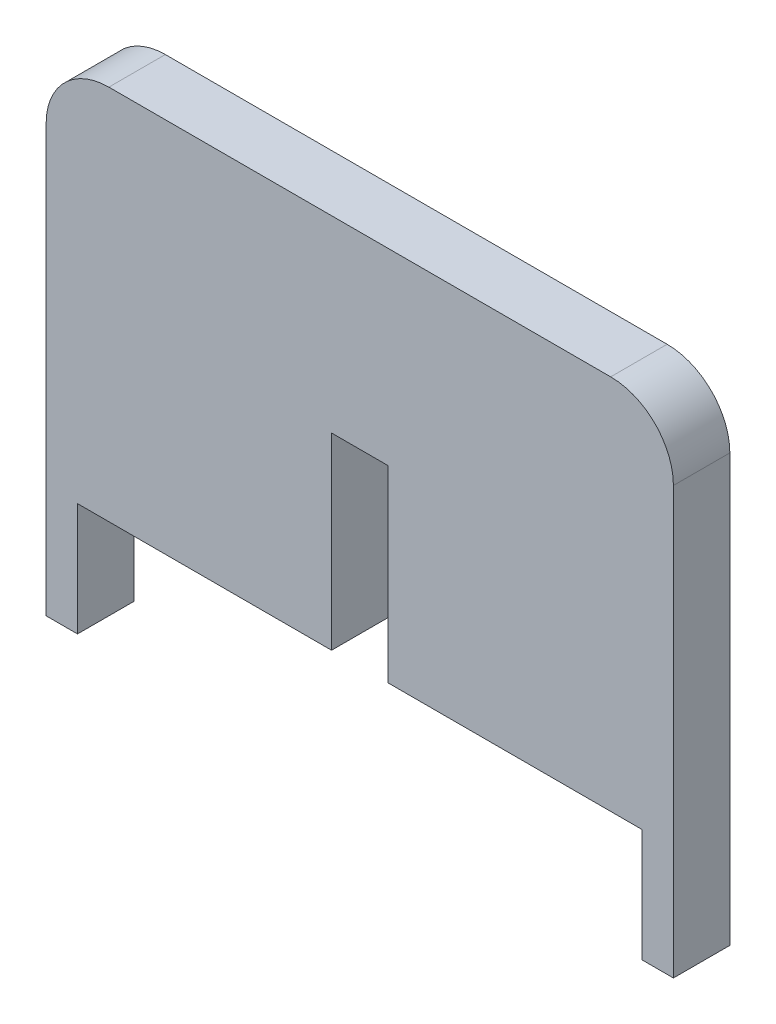
ISO-10303-21;
HEADER;
FILE_DESCRIPTION(('STEP AP214'),'2;1');
FILE_NAME('part.step','',(''),(''),'','','');
FILE_SCHEMA(('AUTOMOTIVE_DESIGN { 1 0 10303 214 1 1 1 1 }'));
ENDSEC;
DATA;
#1=APPLICATION_CONTEXT('core data for automotive mechanical design processes');
#2=APPLICATION_PROTOCOL_DEFINITION('international standard','automotive_design',2000,#1);
#3=PRODUCT_CONTEXT('',#1,'mechanical');
#4=PRODUCT('Part','Part','',(#3));
#5=PRODUCT_RELATED_PRODUCT_CATEGORY('part','',(#4));
#6=PRODUCT_DEFINITION_FORMATION('','',#4);
#7=PRODUCT_DEFINITION_CONTEXT('part definition',#1,'design');
#8=PRODUCT_DEFINITION('design','',#6,#7);
#9=PRODUCT_DEFINITION_SHAPE('','',#8);
#10=(LENGTH_UNIT() NAMED_UNIT(*) SI_UNIT(.MILLI.,.METRE.));
#11=(NAMED_UNIT(*) PLANE_ANGLE_UNIT() SI_UNIT($,.RADIAN.));
#12=(NAMED_UNIT(*) SI_UNIT($,.STERADIAN.) SOLID_ANGLE_UNIT());
#13=UNCERTAINTY_MEASURE_WITH_UNIT(LENGTH_MEASURE(1.E-05),#10,'distance_accuracy_value','');
#14=(GEOMETRIC_REPRESENTATION_CONTEXT(3) GLOBAL_UNCERTAINTY_ASSIGNED_CONTEXT((#13)) GLOBAL_UNIT_ASSIGNED_CONTEXT((#10,
#11,#12)) REPRESENTATION_CONTEXT('',''));
#15=CARTESIAN_POINT('',(0.,0.,0.));
#16=DIRECTION('',(0.,0.,1.));
#17=DIRECTION('',(1.,0.,0.));
#18=AXIS2_PLACEMENT_3D('',#15,#16,#17);
#19=CARTESIAN_POINT('',(-2.25000000000001,0.,4.5));
#20=DIRECTION('',(1.,0.,0.));
#21=DIRECTION('',(0.,0.,-1.));
#22=AXIS2_PLACEMENT_3D('',#19,#20,#21);
#23=PLANE('',#22);
#24=DIRECTION('',(0.,-1.,0.));
#25=VECTOR('',#24,1.);
#26=CARTESIAN_POINT('',(-2.25000000000001,0.,0.));
#27=LINE('',#26,#25);
#28=CARTESIAN_POINT('',(-2.25000000000001,0.,0.));
#29=VERTEX_POINT('',#28);
#30=CARTESIAN_POINT('',(-2.25000000000001,-15.,0.));
#31=VERTEX_POINT('',#30);
#32=EDGE_CURVE('E146',#29,#31,#27,.T.);
#33=ORIENTED_EDGE('',*,*,#32,.F.);
#34=DIRECTION('',(0.,0.,-1.));
#35=VECTOR('',#34,1.);
#36=CARTESIAN_POINT('',(-2.25000000000001,0.,4.5));
#37=LINE('',#36,#35);
#38=CARTESIAN_POINT('',(-2.25000000000001,0.,4.5));
#39=VERTEX_POINT('',#38);
#40=EDGE_CURVE('E140',#39,#29,#37,.T.);
#41=ORIENTED_EDGE('',*,*,#40,.F.);
#42=DIRECTION('',(0.,-1.,0.));
#43=VECTOR('',#42,1.);
#44=CARTESIAN_POINT('',(-2.25000000000001,0.,4.5));
#45=LINE('',#44,#43);
#46=CARTESIAN_POINT('',(-2.25000000000001,-15.,4.5));
#47=VERTEX_POINT('',#46);
#48=EDGE_CURVE('E143',#39,#47,#45,.T.);
#49=ORIENTED_EDGE('',*,*,#48,.T.);
#50=DIRECTION('',(0.,0.,-1.));
#51=VECTOR('',#50,1.);
#52=CARTESIAN_POINT('',(-2.25000000000001,-15.,4.5));
#53=LINE('',#52,#51);
#54=EDGE_CURVE('E190',#47,#31,#53,.T.);
#55=ORIENTED_EDGE('',*,*,#54,.T.);
#56=EDGE_LOOP('',(#33,#41,#49,#55));
#57=FACE_BOUND('',#56,.T.);
#58=ADVANCED_FACE('F35',(#57),#23,.T.);
#59=CARTESIAN_POINT('',(0.,0.,4.5));
#60=DIRECTION('',(0.,1.,0.));
#61=DIRECTION('',(0.,0.,1.));
#62=AXIS2_PLACEMENT_3D('',#59,#60,#61);
#63=PLANE('',#62);
#64=DIRECTION('',(1.,0.,0.));
#65=VECTOR('',#64,1.);
#66=CARTESIAN_POINT('',(0.,0.,0.));
#67=LINE('',#66,#65);
#68=CARTESIAN_POINT('',(2.24999999999999,0.,0.));
#69=VERTEX_POINT('',#68);
#70=EDGE_CURVE('E192',#29,#69,#67,.T.);
#71=ORIENTED_EDGE('',*,*,#70,.T.);
#72=DIRECTION('',(0.,0.,-1.));
#73=VECTOR('',#72,1.);
#74=CARTESIAN_POINT('',(2.24999999999999,0.,4.5));
#75=LINE('',#74,#73);
#76=CARTESIAN_POINT('',(2.24999999999999,0.,4.5));
#77=VERTEX_POINT('',#76);
#78=EDGE_CURVE('E150',#77,#69,#75,.T.);
#79=ORIENTED_EDGE('',*,*,#78,.F.);
#80=DIRECTION('',(1.,0.,0.));
#81=VECTOR('',#80,1.);
#82=CARTESIAN_POINT('',(0.,0.,4.5));
#83=LINE('',#82,#81);
#84=EDGE_CURVE('E153',#39,#77,#83,.T.);
#85=ORIENTED_EDGE('',*,*,#84,.F.);
#86=ORIENTED_EDGE('',*,*,#40,.T.);
#87=EDGE_LOOP('',(#71,#79,#85,#86));
#88=FACE_BOUND('',#87,.T.);
#89=ADVANCED_FACE('F154',(#88),#63,.F.);
#90=CARTESIAN_POINT('',(2.24999999999999,0.,4.5));
#91=DIRECTION('',(1.,0.,0.));
#92=DIRECTION('',(0.,0.,-1.));
#93=AXIS2_PLACEMENT_3D('',#90,#91,#92);
#94=PLANE('',#93);
#95=DIRECTION('',(0.,-1.,0.));
#96=VECTOR('',#95,1.);
#97=CARTESIAN_POINT('',(2.24999999999999,0.,0.));
#98=LINE('',#97,#96);
#99=CARTESIAN_POINT('',(2.24999999999999,-15.,0.));
#100=VERTEX_POINT('',#99);
#101=EDGE_CURVE('E194',#69,#100,#98,.T.);
#102=ORIENTED_EDGE('',*,*,#101,.T.);
#103=DIRECTION('',(0.,0.,-1.));
#104=VECTOR('',#103,1.);
#105=CARTESIAN_POINT('',(2.24999999999999,-15.,4.5));
#106=LINE('',#105,#104);
#107=CARTESIAN_POINT('',(2.24999999999999,-15.,4.5));
#108=VERTEX_POINT('',#107);
#109=EDGE_CURVE('E232',#108,#100,#106,.T.);
#110=ORIENTED_EDGE('',*,*,#109,.F.);
#111=DIRECTION('',(0.,-1.,0.));
#112=VECTOR('',#111,1.);
#113=CARTESIAN_POINT('',(2.24999999999999,0.,4.5));
#114=LINE('',#113,#112);
#115=EDGE_CURVE('E157',#77,#108,#114,.T.);
#116=ORIENTED_EDGE('',*,*,#115,.F.);
#117=ORIENTED_EDGE('',*,*,#78,.T.);
#118=EDGE_LOOP('',(#102,#110,#116,#117));
#119=FACE_BOUND('',#118,.T.);
#120=ADVANCED_FACE('F272',(#119),#94,.F.);
#121=CARTESIAN_POINT('',(0.,-15.,4.5));
#122=DIRECTION('',(0.,-1.,0.));
#123=DIRECTION('',(0.,0.,-1.));
#124=AXIS2_PLACEMENT_3D('',#121,#122,#123);
#125=PLANE('',#124);
#126=DIRECTION('',(-1.,0.,0.));
#127=VECTOR('',#126,1.);
#128=CARTESIAN_POINT('',(0.,-15.,0.));
#129=LINE('',#128,#127);
#130=CARTESIAN_POINT('',(22.5,-15.,0.));
#131=VERTEX_POINT('',#130);
#132=EDGE_CURVE('E197',#131,#100,#129,.T.);
#133=ORIENTED_EDGE('',*,*,#132,.F.);
#134=DIRECTION('',(0.,0.,-1.));
#135=VECTOR('',#134,1.);
#136=CARTESIAN_POINT('',(22.5,-15.,4.5));
#137=LINE('',#136,#135);
#138=CARTESIAN_POINT('',(22.5,-15.,4.5));
#139=VERTEX_POINT('',#138);
#140=EDGE_CURVE('E230',#139,#131,#137,.T.);
#141=ORIENTED_EDGE('',*,*,#140,.F.);
#142=DIRECTION('',(-1.,0.,0.));
#143=VECTOR('',#142,1.);
#144=CARTESIAN_POINT('',(0.,-15.,4.5));
#145=LINE('',#144,#143);
#146=EDGE_CURVE('E170',#139,#108,#145,.T.);
#147=ORIENTED_EDGE('',*,*,#146,.T.);
#148=ORIENTED_EDGE('',*,*,#109,.T.);
#149=EDGE_LOOP('',(#133,#141,#147,#148));
#150=FACE_BOUND('',#149,.T.);
#151=ADVANCED_FACE('F267',(#150),#125,.T.);
#152=CARTESIAN_POINT('',(22.5,0.,4.5));
#153=DIRECTION('',(1.,0.,0.));
#154=DIRECTION('',(0.,1.,0.));
#155=AXIS2_PLACEMENT_3D('',#152,#153,#154);
#156=PLANE('',#155);
#157=DIRECTION('',(0.,-1.,0.));
#158=VECTOR('',#157,1.);
#159=CARTESIAN_POINT('',(22.5,0.,0.));
#160=LINE('',#159,#158);
#161=CARTESIAN_POINT('',(22.5,-24.,0.));
#162=VERTEX_POINT('',#161);
#163=EDGE_CURVE('E200',#131,#162,#160,.T.);
#164=ORIENTED_EDGE('',*,*,#163,.T.);
#165=DIRECTION('',(0.,0.,-1.));
#166=VECTOR('',#165,1.);
#167=CARTESIAN_POINT('',(22.5,-24.,4.5));
#168=LINE('',#167,#166);
#169=CARTESIAN_POINT('',(22.5,-24.,4.5));
#170=VERTEX_POINT('',#169);
#171=EDGE_CURVE('E228',#170,#162,#168,.T.);
#172=ORIENTED_EDGE('',*,*,#171,.F.);
#173=DIRECTION('',(0.,-1.,0.));
#174=VECTOR('',#173,1.);
#175=CARTESIAN_POINT('',(22.5,0.,4.5));
#176=LINE('',#175,#174);
#177=EDGE_CURVE('E173',#139,#170,#176,.T.);
#178=ORIENTED_EDGE('',*,*,#177,.F.);
#179=ORIENTED_EDGE('',*,*,#140,.T.);
#180=EDGE_LOOP('',(#164,#172,#178,#179));
#181=FACE_BOUND('',#180,.T.);
#182=ADVANCED_FACE('F303',(#181),#156,.F.);
#183=CARTESIAN_POINT('',(0.,-24.,4.5));
#184=DIRECTION('',(0.,-1.,0.));
#185=DIRECTION('',(0.,0.,-1.));
#186=AXIS2_PLACEMENT_3D('',#183,#184,#185);
#187=PLANE('',#186);
#188=DIRECTION('',(-1.,0.,0.));
#189=VECTOR('',#188,1.);
#190=CARTESIAN_POINT('',(0.,-24.,0.));
#191=LINE('',#190,#189);
#192=CARTESIAN_POINT('',(25.,-24.,0.));
#193=VERTEX_POINT('',#192);
#194=EDGE_CURVE('E203',#193,#162,#191,.T.);
#195=ORIENTED_EDGE('',*,*,#194,.F.);
#196=DIRECTION('',(0.,0.,-1.));
#197=VECTOR('',#196,1.);
#198=CARTESIAN_POINT('',(25.,-24.,4.5));
#199=LINE('',#198,#197);
#200=CARTESIAN_POINT('',(25.,-24.,4.5));
#201=VERTEX_POINT('',#200);
#202=EDGE_CURVE('E226',#201,#193,#199,.T.);
#203=ORIENTED_EDGE('',*,*,#202,.F.);
#204=DIRECTION('',(-1.,0.,0.));
#205=VECTOR('',#204,1.);
#206=CARTESIAN_POINT('',(0.,-24.,4.5));
#207=LINE('',#206,#205);
#208=EDGE_CURVE('E175',#201,#170,#207,.T.);
#209=ORIENTED_EDGE('',*,*,#208,.T.);
#210=ORIENTED_EDGE('',*,*,#171,.T.);
#211=EDGE_LOOP('',(#195,#203,#209,#210));
#212=FACE_BOUND('',#211,.T.);
#213=ADVANCED_FACE('F260',(#212),#187,.T.);
#214=CARTESIAN_POINT('',(25.,0.,4.5));
#215=DIRECTION('',(-1.,0.,0.));
#216=DIRECTION('',(0.,0.,1.));
#217=AXIS2_PLACEMENT_3D('',#214,#215,#216);
#218=PLANE('',#217);
#219=DIRECTION('',(0.,1.,0.));
#220=VECTOR('',#219,1.);
#221=CARTESIAN_POINT('',(25.,0.,0.));
#222=LINE('',#221,#220);
#223=CARTESIAN_POINT('',(25.,10.,0.));
#224=VERTEX_POINT('',#223);
#225=EDGE_CURVE('E206',#193,#224,#222,.T.);
#226=ORIENTED_EDGE('',*,*,#225,.T.);
#227=DIRECTION('',(0.,0.,-1.));
#228=VECTOR('',#227,1.);
#229=CARTESIAN_POINT('',(25.,10.,4.5));
#230=LINE('',#229,#228);
#231=CARTESIAN_POINT('',(25.,10.,4.5));
#232=VERTEX_POINT('',#231);
#233=EDGE_CURVE('E58',#224,#232,#230,.F.);
#234=ORIENTED_EDGE('',*,*,#233,.T.);
#235=DIRECTION('',(0.,1.,0.));
#236=VECTOR('',#235,1.);
#237=CARTESIAN_POINT('',(25.,0.,4.5));
#238=LINE('',#237,#236);
#239=EDGE_CURVE('E178',#201,#232,#238,.T.);
#240=ORIENTED_EDGE('',*,*,#239,.F.);
#241=ORIENTED_EDGE('',*,*,#202,.T.);
#242=EDGE_LOOP('',(#226,#234,#240,#241));
#243=FACE_BOUND('',#242,.T.);
#244=ADVANCED_FACE('F258',(#243),#218,.F.);
#245=CARTESIAN_POINT('',(0.,15.,4.5));
#246=DIRECTION('',(0.,-1.,0.));
#247=DIRECTION('',(0.,0.,-1.));
#248=AXIS2_PLACEMENT_3D('',#245,#246,#247);
#249=PLANE('',#248);
#250=DIRECTION('',(-1.,0.,0.));
#251=VECTOR('',#250,1.);
#252=CARTESIAN_POINT('',(0.,15.,4.5));
#253=LINE('',#252,#251);
#254=CARTESIAN_POINT('',(20.,15.,4.5));
#255=VERTEX_POINT('',#254);
#256=CARTESIAN_POINT('',(-20.,15.,4.5));
#257=VERTEX_POINT('',#256);
#258=EDGE_CURVE('E180',#255,#257,#253,.T.);
#259=ORIENTED_EDGE('',*,*,#258,.F.);
#260=DIRECTION('',(0.,0.,-1.));
#261=VECTOR('',#260,1.);
#262=CARTESIAN_POINT('',(20.,15.,4.5));
#263=LINE('',#262,#261);
#264=CARTESIAN_POINT('',(20.,15.,0.));
#265=VERTEX_POINT('',#264);
#266=EDGE_CURVE('E236',#255,#265,#263,.T.);
#267=ORIENTED_EDGE('',*,*,#266,.T.);
#268=DIRECTION('',(-1.,0.,0.));
#269=VECTOR('',#268,1.);
#270=CARTESIAN_POINT('',(0.,15.,0.));
#271=LINE('',#270,#269);
#272=CARTESIAN_POINT('',(-20.,15.,0.));
#273=VERTEX_POINT('',#272);
#274=EDGE_CURVE('E208',#265,#273,#271,.T.);
#275=ORIENTED_EDGE('',*,*,#274,.T.);
#276=DIRECTION('',(0.,0.,-1.));
#277=VECTOR('',#276,1.);
#278=CARTESIAN_POINT('',(-20.,15.,4.5));
#279=LINE('',#278,#277);
#280=EDGE_CURVE('E149',#273,#257,#279,.F.);
#281=ORIENTED_EDGE('',*,*,#280,.T.);
#282=EDGE_LOOP('',(#259,#267,#275,#281));
#283=FACE_BOUND('',#282,.T.);
#284=ADVANCED_FACE('F250',(#283),#249,.F.);
#285=CARTESIAN_POINT('',(-25.,0.,4.5));
#286=DIRECTION('',(-1.,0.,0.));
#287=DIRECTION('',(0.,0.,1.));
#288=AXIS2_PLACEMENT_3D('',#285,#286,#287);
#289=PLANE('',#288);
#290=DIRECTION('',(0.,1.,0.));
#291=VECTOR('',#290,1.);
#292=CARTESIAN_POINT('',(-25.,0.,4.5));
#293=LINE('',#292,#291);
#294=CARTESIAN_POINT('',(-25.,-24.,4.5));
#295=VERTEX_POINT('',#294);
#296=CARTESIAN_POINT('',(-25.,10.,4.5));
#297=VERTEX_POINT('',#296);
#298=EDGE_CURVE('E182',#295,#297,#293,.T.);
#299=ORIENTED_EDGE('',*,*,#298,.T.);
#300=DIRECTION('',(0.,0.,-1.));
#301=VECTOR('',#300,1.);
#302=CARTESIAN_POINT('',(-25.,10.,0.));
#303=LINE('',#302,#301);
#304=CARTESIAN_POINT('',(-25.,10.,0.));
#305=VERTEX_POINT('',#304);
#306=EDGE_CURVE('E11',#297,#305,#303,.T.);
#307=ORIENTED_EDGE('',*,*,#306,.T.);
#308=DIRECTION('',(0.,1.,0.));
#309=VECTOR('',#308,1.);
#310=CARTESIAN_POINT('',(-25.,0.,0.));
#311=LINE('',#310,#309);
#312=CARTESIAN_POINT('',(-25.,-24.,0.));
#313=VERTEX_POINT('',#312);
#314=EDGE_CURVE('E211',#313,#305,#311,.T.);
#315=ORIENTED_EDGE('',*,*,#314,.F.);
#316=DIRECTION('',(0.,0.,-1.));
#317=VECTOR('',#316,1.);
#318=CARTESIAN_POINT('',(-25.,-24.,4.5));
#319=LINE('',#318,#317);
#320=EDGE_CURVE('E224',#295,#313,#319,.T.);
#321=ORIENTED_EDGE('',*,*,#320,.F.);
#322=EDGE_LOOP('',(#299,#307,#315,#321));
#323=FACE_BOUND('',#322,.T.);
#324=ADVANCED_FACE('F284',(#323),#289,.T.);
#325=CARTESIAN_POINT('',(0.,-24.,4.5));
#326=DIRECTION('',(0.,1.,0.));
#327=DIRECTION('',(0.,0.,1.));
#328=AXIS2_PLACEMENT_3D('',#325,#326,#327);
#329=PLANE('',#328);
#330=DIRECTION('',(1.,0.,0.));
#331=VECTOR('',#330,1.);
#332=CARTESIAN_POINT('',(0.,-24.,0.));
#333=LINE('',#332,#331);
#334=CARTESIAN_POINT('',(-22.5,-24.,0.));
#335=VERTEX_POINT('',#334);
#336=EDGE_CURVE('E214',#313,#335,#333,.T.);
#337=ORIENTED_EDGE('',*,*,#336,.T.);
#338=DIRECTION('',(0.,0.,-1.));
#339=VECTOR('',#338,1.);
#340=CARTESIAN_POINT('',(-22.5,-24.,4.5));
#341=LINE('',#340,#339);
#342=CARTESIAN_POINT('',(-22.5,-24.,4.5));
#343=VERTEX_POINT('',#342);
#344=EDGE_CURVE('E222',#343,#335,#341,.T.);
#345=ORIENTED_EDGE('',*,*,#344,.F.);
#346=DIRECTION('',(1.,0.,0.));
#347=VECTOR('',#346,1.);
#348=CARTESIAN_POINT('',(0.,-24.,4.5));
#349=LINE('',#348,#347);
#350=EDGE_CURVE('E184',#295,#343,#349,.T.);
#351=ORIENTED_EDGE('',*,*,#350,.F.);
#352=ORIENTED_EDGE('',*,*,#320,.T.);
#353=EDGE_LOOP('',(#337,#345,#351,#352));
#354=FACE_BOUND('',#353,.T.);
#355=ADVANCED_FACE('F314',(#354),#329,.F.);
#356=CARTESIAN_POINT('',(-22.5,0.,4.5));
#357=DIRECTION('',(1.,0.,0.));
#358=DIRECTION('',(0.,1.,0.));
#359=AXIS2_PLACEMENT_3D('',#356,#357,#358);
#360=PLANE('',#359);
#361=DIRECTION('',(0.,-1.,0.));
#362=VECTOR('',#361,1.);
#363=CARTESIAN_POINT('',(-22.5,0.,0.));
#364=LINE('',#363,#362);
#365=CARTESIAN_POINT('',(-22.5,-15.,0.));
#366=VERTEX_POINT('',#365);
#367=EDGE_CURVE('E166',#366,#335,#364,.T.);
#368=ORIENTED_EDGE('',*,*,#367,.F.);
#369=DIRECTION('',(0.,0.,-1.));
#370=VECTOR('',#369,1.);
#371=CARTESIAN_POINT('',(-22.5,-15.,4.5));
#372=LINE('',#371,#370);
#373=CARTESIAN_POINT('',(-22.5,-15.,4.5));
#374=VERTEX_POINT('',#373);
#375=EDGE_CURVE('E220',#374,#366,#372,.T.);
#376=ORIENTED_EDGE('',*,*,#375,.F.);
#377=DIRECTION('',(0.,-1.,0.));
#378=VECTOR('',#377,1.);
#379=CARTESIAN_POINT('',(-22.5,0.,4.5));
#380=LINE('',#379,#378);
#381=EDGE_CURVE('E186',#374,#343,#380,.T.);
#382=ORIENTED_EDGE('',*,*,#381,.T.);
#383=ORIENTED_EDGE('',*,*,#344,.T.);
#384=EDGE_LOOP('',(#368,#376,#382,#383));
#385=FACE_BOUND('',#384,.T.);
#386=ADVANCED_FACE('F278',(#385),#360,.T.);
#387=CARTESIAN_POINT('',(0.,-15.,4.5));
#388=DIRECTION('',(0.,-1.,0.));
#389=DIRECTION('',(0.,0.,-1.));
#390=AXIS2_PLACEMENT_3D('',#387,#388,#389);
#391=PLANE('',#390);
#392=DIRECTION('',(-1.,0.,0.));
#393=VECTOR('',#392,1.);
#394=CARTESIAN_POINT('',(0.,-15.,0.));
#395=LINE('',#394,#393);
#396=EDGE_CURVE('E163',#31,#366,#395,.T.);
#397=ORIENTED_EDGE('',*,*,#396,.F.);
#398=ORIENTED_EDGE('',*,*,#54,.F.);
#399=DIRECTION('',(-1.,0.,0.));
#400=VECTOR('',#399,1.);
#401=CARTESIAN_POINT('',(0.,-15.,4.5));
#402=LINE('',#401,#400);
#403=EDGE_CURVE('E162',#47,#374,#402,.T.);
#404=ORIENTED_EDGE('',*,*,#403,.T.);
#405=ORIENTED_EDGE('',*,*,#375,.T.);
#406=EDGE_LOOP('',(#397,#398,#404,#405));
#407=FACE_BOUND('',#406,.T.);
#408=ADVANCED_FACE('F275',(#407),#391,.T.);
#409=CARTESIAN_POINT('',(0.,0.,4.5));
#410=DIRECTION('',(0.,0.,1.));
#411=DIRECTION('',(1.,0.,0.));
#412=AXIS2_PLACEMENT_3D('',#409,#410,#411);
#413=PLANE('',#412);
#414=ORIENTED_EDGE('',*,*,#239,.T.);
#415=CARTESIAN_POINT('',(20.,10.,4.5));
#416=DIRECTION('',(0.,0.,1.));
#417=DIRECTION('',(1.,0.,0.));
#418=AXIS2_PLACEMENT_3D('',#415,#416,#417);
#419=CIRCLE('',#418,5.);
#420=EDGE_CURVE('E43',#232,#255,#419,.T.);
#421=ORIENTED_EDGE('',*,*,#420,.T.);
#422=ORIENTED_EDGE('',*,*,#258,.T.);
#423=CARTESIAN_POINT('',(-20.,10.,4.5));
#424=DIRECTION('',(0.,0.,1.));
#425=DIRECTION('',(1.,0.,0.));
#426=AXIS2_PLACEMENT_3D('',#423,#424,#425);
#427=CIRCLE('',#426,5.);
#428=EDGE_CURVE('E50',#257,#297,#427,.T.);
#429=ORIENTED_EDGE('',*,*,#428,.T.);
#430=ORIENTED_EDGE('',*,*,#298,.F.);
#431=ORIENTED_EDGE('',*,*,#350,.T.);
#432=ORIENTED_EDGE('',*,*,#381,.F.);
#433=ORIENTED_EDGE('',*,*,#403,.F.);
#434=ORIENTED_EDGE('',*,*,#48,.F.);
#435=ORIENTED_EDGE('',*,*,#84,.T.);
#436=ORIENTED_EDGE('',*,*,#115,.T.);
#437=ORIENTED_EDGE('',*,*,#146,.F.);
#438=ORIENTED_EDGE('',*,*,#177,.T.);
#439=ORIENTED_EDGE('',*,*,#208,.F.);
#440=EDGE_LOOP('',(#414,#421,#422,#429,#430,#431,#432,#433,#434,#435,#436,#437,#438,#439));
#441=FACE_BOUND('',#440,.T.);
#442=ADVANCED_FACE('F159',(#441),#413,.T.);
#443=CARTESIAN_POINT('',(0.,0.,0.));
#444=DIRECTION('',(0.,0.,1.));
#445=DIRECTION('',(1.,0.,0.));
#446=AXIS2_PLACEMENT_3D('',#443,#444,#445);
#447=PLANE('',#446);
#448=ORIENTED_EDGE('',*,*,#274,.F.);
#449=CARTESIAN_POINT('',(20.,10.,0.));
#450=DIRECTION('',(0.,0.,1.));
#451=DIRECTION('',(1.,0.,0.));
#452=AXIS2_PLACEMENT_3D('',#449,#450,#451);
#453=CIRCLE('',#452,5.);
#454=EDGE_CURVE('E241',#265,#224,#453,.F.);
#455=ORIENTED_EDGE('',*,*,#454,.T.);
#456=ORIENTED_EDGE('',*,*,#225,.F.);
#457=ORIENTED_EDGE('',*,*,#194,.T.);
#458=ORIENTED_EDGE('',*,*,#163,.F.);
#459=ORIENTED_EDGE('',*,*,#132,.T.);
#460=ORIENTED_EDGE('',*,*,#101,.F.);
#461=ORIENTED_EDGE('',*,*,#70,.F.);
#462=ORIENTED_EDGE('',*,*,#32,.T.);
#463=ORIENTED_EDGE('',*,*,#396,.T.);
#464=ORIENTED_EDGE('',*,*,#367,.T.);
#465=ORIENTED_EDGE('',*,*,#336,.F.);
#466=ORIENTED_EDGE('',*,*,#314,.T.);
#467=CARTESIAN_POINT('',(-20.,10.,0.));
#468=DIRECTION('',(0.,0.,1.));
#469=DIRECTION('',(1.,0.,0.));
#470=AXIS2_PLACEMENT_3D('',#467,#468,#469);
#471=CIRCLE('',#470,5.);
#472=EDGE_CURVE('E239',#305,#273,#471,.F.);
#473=ORIENTED_EDGE('',*,*,#472,.T.);
#474=EDGE_LOOP('',(#448,#455,#456,#457,#458,#459,#460,#461,#462,#463,#464,#465,#466,#473));
#475=FACE_BOUND('',#474,.T.);
#476=ADVANCED_FACE('F256',(#475),#447,.F.);
#477=CARTESIAN_POINT('',(20.,10.,4.5));
#478=DIRECTION('',(0.,0.,-1.));
#479=DIRECTION('',(-1.,0.,0.));
#480=AXIS2_PLACEMENT_3D('',#477,#478,#479);
#481=CYLINDRICAL_SURFACE('',#480,5.);
#482=ORIENTED_EDGE('',*,*,#420,.F.);
#483=ORIENTED_EDGE('',*,*,#233,.F.);
#484=ORIENTED_EDGE('',*,*,#454,.F.);
#485=ORIENTED_EDGE('',*,*,#266,.F.);
#486=EDGE_LOOP('',(#482,#483,#484,#485));
#487=FACE_BOUND('',#486,.T.);
#488=ADVANCED_FACE('F253',(#487),#481,.T.);
#489=CARTESIAN_POINT('',(-20.,10.,4.5));
#490=DIRECTION('',(0.,0.,1.));
#491=DIRECTION('',(1.,0.,0.));
#492=AXIS2_PLACEMENT_3D('',#489,#490,#491);
#493=CYLINDRICAL_SURFACE('',#492,5.);
#494=ORIENTED_EDGE('',*,*,#428,.F.);
#495=ORIENTED_EDGE('',*,*,#280,.F.);
#496=ORIENTED_EDGE('',*,*,#472,.F.);
#497=ORIENTED_EDGE('',*,*,#306,.F.);
#498=EDGE_LOOP('',(#494,#495,#496,#497));
#499=FACE_BOUND('',#498,.T.);
#500=ADVANCED_FACE('F37',(#499),#493,.T.);
#501=CLOSED_SHELL('',(#58,#89,#120,#151,#182,#213,#244,#284,#324,#355,#386,#408,#442,#476,#488,#500));
#502=MANIFOLD_SOLID_BREP('B2',#501);
#503=ADVANCED_BREP_SHAPE_REPRESENTATION('',(#18,#502),#14);
#504=SHAPE_DEFINITION_REPRESENTATION(#9,#503);
ENDSEC;
END-ISO-10303-21;
